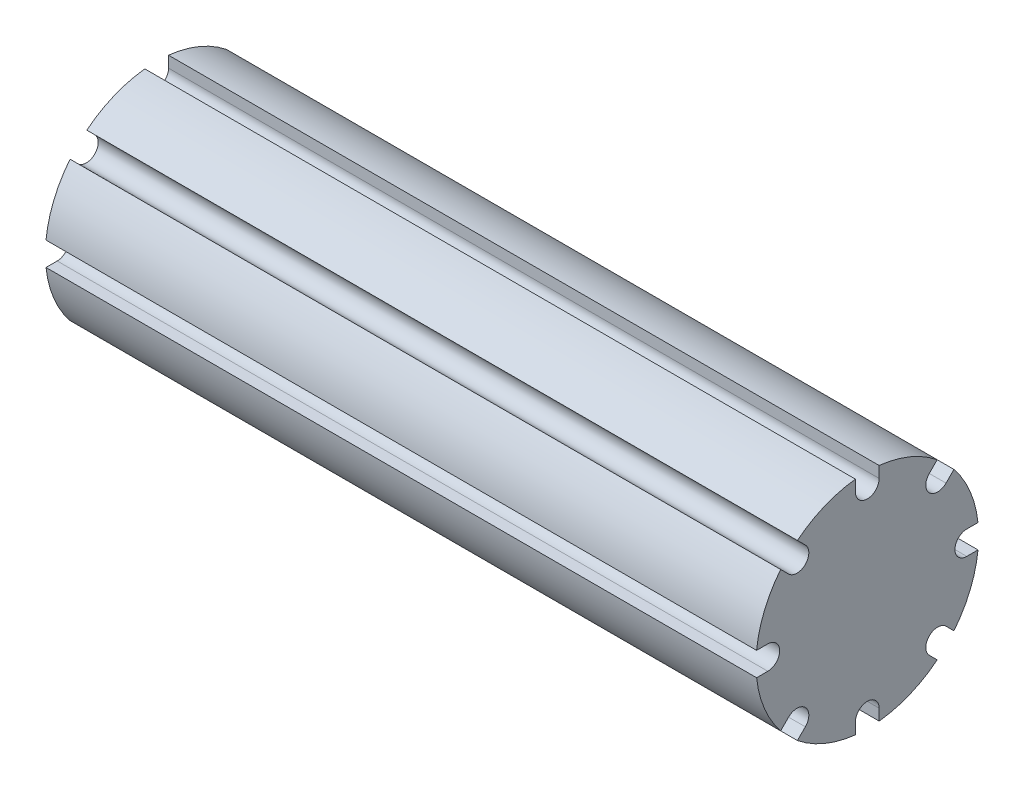
ISO-10303-21;
HEADER;
FILE_DESCRIPTION(('STEP AP214'),'2;1');
FILE_NAME('part.step','',(''),(''),'','','');
FILE_SCHEMA(('AUTOMOTIVE_DESIGN { 1 0 10303 214 1 1 1 1 }'));
ENDSEC;
DATA;
#1=APPLICATION_CONTEXT('core data for automotive mechanical design processes');
#2=APPLICATION_PROTOCOL_DEFINITION('international standard','automotive_design',2000,#1);
#3=PRODUCT_CONTEXT('',#1,'mechanical');
#4=PRODUCT('Part','Part','',(#3));
#5=PRODUCT_RELATED_PRODUCT_CATEGORY('part','',(#4));
#6=PRODUCT_DEFINITION_FORMATION('','',#4);
#7=PRODUCT_DEFINITION_CONTEXT('part definition',#1,'design');
#8=PRODUCT_DEFINITION('design','',#6,#7);
#9=PRODUCT_DEFINITION_SHAPE('','',#8);
#10=(LENGTH_UNIT() NAMED_UNIT(*) SI_UNIT(.MILLI.,.METRE.));
#11=(NAMED_UNIT(*) PLANE_ANGLE_UNIT() SI_UNIT($,.RADIAN.));
#12=(NAMED_UNIT(*) SI_UNIT($,.STERADIAN.) SOLID_ANGLE_UNIT());
#13=UNCERTAINTY_MEASURE_WITH_UNIT(LENGTH_MEASURE(1.E-05),#10,'distance_accuracy_value','');
#14=(GEOMETRIC_REPRESENTATION_CONTEXT(3) GLOBAL_UNCERTAINTY_ASSIGNED_CONTEXT((#13)) GLOBAL_UNIT_ASSIGNED_CONTEXT((#10,
#11,#12)) REPRESENTATION_CONTEXT('',''));
#15=CARTESIAN_POINT('',(0.,0.,0.));
#16=DIRECTION('',(0.,0.,1.));
#17=DIRECTION('',(1.,0.,0.));
#18=AXIS2_PLACEMENT_3D('',#15,#16,#17);
#19=CARTESIAN_POINT('',(75.,0.,0.));
#20=DIRECTION('',(-1.,0.,0.));
#21=DIRECTION('',(0.,0.,1.));
#22=AXIS2_PLACEMENT_3D('',#19,#20,#21);
#23=CYLINDRICAL_SURFACE('',#22,23.5);
#24=DIRECTION('',(1.,0.,0.));
#25=VECTOR('',#24,1.);
#26=CARTESIAN_POINT('',(-75.,2.49999999999992,-23.3666428910959));
#27=LINE('',#26,#25);
#28=CARTESIAN_POINT('',(-75.,2.49999999999992,-23.3666428910959));
#29=VERTEX_POINT('',#28);
#30=CARTESIAN_POINT('',(75.,2.49999999999992,-23.3666428910959));
#31=VERTEX_POINT('',#30);
#32=EDGE_CURVE('E336',#29,#31,#27,.T.);
#33=ORIENTED_EDGE('',*,*,#32,.F.);
#34=CARTESIAN_POINT('',(-75.,0.,0.));
#35=DIRECTION('',(1.,0.,0.));
#36=DIRECTION('',(0.,0.,-1.));
#37=AXIS2_PLACEMENT_3D('',#34,#35,#36);
#38=CIRCLE('',#37,23.5);
#39=CARTESIAN_POINT('',(-75.,14.7549446888919,-18.2904785948247));
#40=VERTEX_POINT('',#39);
#41=EDGE_CURVE('E487',#29,#40,#38,.T.);
#42=ORIENTED_EDGE('',*,*,#41,.T.);
#43=DIRECTION('',(1.,0.,0.));
#44=VECTOR('',#43,1.);
#45=CARTESIAN_POINT('',(-75.,14.7549446888919,-18.2904785948247));
#46=LINE('',#45,#44);
#47=CARTESIAN_POINT('',(75.,14.7549446888919,-18.2904785948247));
#48=VERTEX_POINT('',#47);
#49=EDGE_CURVE('E56',#40,#48,#46,.T.);
#50=ORIENTED_EDGE('',*,*,#49,.T.);
#51=CARTESIAN_POINT('',(75.,0.,0.));
#52=DIRECTION('',(1.,0.,0.));
#53=DIRECTION('',(0.,0.,-1.));
#54=AXIS2_PLACEMENT_3D('',#51,#52,#53);
#55=CIRCLE('',#54,23.5);
#56=EDGE_CURVE('E478',#31,#48,#55,.T.);
#57=ORIENTED_EDGE('',*,*,#56,.F.);
#58=EDGE_LOOP('',(#33,#42,#50,#57));
#59=FACE_BOUND('',#58,.T.);
#60=ADVANCED_FACE('F39',(#59),#23,.T.);
#61=CARTESIAN_POINT('',(-75.,-14.754944688892,-18.2904785948246));
#62=VERTEX_POINT('',#61);
#63=CARTESIAN_POINT('',(-75.,-2.50000000000008,-23.3666428910958));
#64=VERTEX_POINT('',#63);
#65=EDGE_CURVE('E490',#62,#64,#38,.T.);
#66=ORIENTED_EDGE('',*,*,#65,.T.);
#67=DIRECTION('',(1.,0.,0.));
#68=VECTOR('',#67,1.);
#69=CARTESIAN_POINT('',(-75.,-2.50000000000008,-23.3666428910958));
#70=LINE('',#69,#68);
#71=CARTESIAN_POINT('',(75.,-2.50000000000008,-23.3666428910958));
#72=VERTEX_POINT('',#71);
#73=EDGE_CURVE('E64',#64,#72,#70,.T.);
#74=ORIENTED_EDGE('',*,*,#73,.T.);
#75=CARTESIAN_POINT('',(75.,-14.754944688892,-18.2904785948246));
#76=VERTEX_POINT('',#75);
#77=EDGE_CURVE('E480',#76,#72,#55,.T.);
#78=ORIENTED_EDGE('',*,*,#77,.F.);
#79=DIRECTION('',(1.,0.,0.));
#80=VECTOR('',#79,1.);
#81=CARTESIAN_POINT('',(-75.,-14.754944688892,-18.2904785948246));
#82=LINE('',#81,#80);
#83=EDGE_CURVE('E359',#62,#76,#82,.T.);
#84=ORIENTED_EDGE('',*,*,#83,.F.);
#85=EDGE_LOOP('',(#66,#74,#78,#84));
#86=FACE_BOUND('',#85,.T.);
#87=ADVANCED_FACE('F537',(#86),#23,.T.);
#88=CARTESIAN_POINT('',(-75.,-23.3666428910959,-2.5));
#89=VERTEX_POINT('',#88);
#90=CARTESIAN_POINT('',(-75.,-18.2904785948248,-14.7549446888918));
#91=VERTEX_POINT('',#90);
#92=EDGE_CURVE('E495',#89,#91,#38,.T.);
#93=ORIENTED_EDGE('',*,*,#92,.T.);
#94=DIRECTION('',(1.,0.,0.));
#95=VECTOR('',#94,1.);
#96=CARTESIAN_POINT('',(-75.,-18.2904785948248,-14.7549446888918));
#97=LINE('',#96,#95);
#98=CARTESIAN_POINT('',(75.,-18.2904785948248,-14.7549446888918));
#99=VERTEX_POINT('',#98);
#100=EDGE_CURVE('E361',#91,#99,#97,.T.);
#101=ORIENTED_EDGE('',*,*,#100,.T.);
#102=CARTESIAN_POINT('',(75.,-23.3666428910959,-2.5));
#103=VERTEX_POINT('',#102);
#104=EDGE_CURVE('E526',#103,#99,#55,.T.);
#105=ORIENTED_EDGE('',*,*,#104,.F.);
#106=DIRECTION('',(1.,0.,0.));
#107=VECTOR('',#106,1.);
#108=CARTESIAN_POINT('',(-75.,-23.3666428910959,-2.5));
#109=LINE('',#108,#107);
#110=EDGE_CURVE('E384',#89,#103,#109,.T.);
#111=ORIENTED_EDGE('',*,*,#110,.F.);
#112=EDGE_LOOP('',(#93,#101,#105,#111));
#113=FACE_BOUND('',#112,.T.);
#114=ADVANCED_FACE('F586',(#113),#23,.T.);
#115=CARTESIAN_POINT('',(-75.,-18.2904785948245,14.7549446888921));
#116=VERTEX_POINT('',#115);
#117=CARTESIAN_POINT('',(-75.,-23.3666428910959,2.5));
#118=VERTEX_POINT('',#117);
#119=EDGE_CURVE('E500',#116,#118,#38,.T.);
#120=ORIENTED_EDGE('',*,*,#119,.T.);
#121=DIRECTION('',(1.,0.,0.));
#122=VECTOR('',#121,1.);
#123=CARTESIAN_POINT('',(-75.,-23.3666428910959,2.5));
#124=LINE('',#123,#122);
#125=CARTESIAN_POINT('',(75.,-23.3666428910959,2.5));
#126=VERTEX_POINT('',#125);
#127=EDGE_CURVE('E386',#118,#126,#124,.T.);
#128=ORIENTED_EDGE('',*,*,#127,.T.);
#129=CARTESIAN_POINT('',(75.,-18.2904785948245,14.7549446888921));
#130=VERTEX_POINT('',#129);
#131=EDGE_CURVE('E523',#130,#126,#55,.T.);
#132=ORIENTED_EDGE('',*,*,#131,.F.);
#133=DIRECTION('',(1.,0.,0.));
#134=VECTOR('',#133,1.);
#135=CARTESIAN_POINT('',(-75.,-18.2904785948245,14.7549446888921));
#136=LINE('',#135,#134);
#137=EDGE_CURVE('E407',#116,#130,#136,.T.);
#138=ORIENTED_EDGE('',*,*,#137,.F.);
#139=EDGE_LOOP('',(#120,#128,#132,#138));
#140=FACE_BOUND('',#139,.T.);
#141=ADVANCED_FACE('F581',(#140),#23,.T.);
#142=CARTESIAN_POINT('',(-75.,-2.49999999999976,23.3666428910959));
#143=VERTEX_POINT('',#142);
#144=CARTESIAN_POINT('',(-75.,-14.7549446888918,18.2904785948248));
#145=VERTEX_POINT('',#144);
#146=EDGE_CURVE('E486',#143,#145,#38,.T.);
#147=ORIENTED_EDGE('',*,*,#146,.T.);
#148=DIRECTION('',(1.,0.,0.));
#149=VECTOR('',#148,1.);
#150=CARTESIAN_POINT('',(-75.,-14.7549446888918,18.2904785948248));
#151=LINE('',#150,#149);
#152=CARTESIAN_POINT('',(75.,-14.7549446888918,18.2904785948248));
#153=VERTEX_POINT('',#152);
#154=EDGE_CURVE('E409',#145,#153,#151,.T.);
#155=ORIENTED_EDGE('',*,*,#154,.T.);
#156=CARTESIAN_POINT('',(75.,-2.49999999999976,23.3666428910959));
#157=VERTEX_POINT('',#156);
#158=EDGE_CURVE('E521',#157,#153,#55,.T.);
#159=ORIENTED_EDGE('',*,*,#158,.F.);
#160=DIRECTION('',(1.,0.,0.));
#161=VECTOR('',#160,1.);
#162=CARTESIAN_POINT('',(-75.,-2.49999999999976,23.3666428910959));
#163=LINE('',#162,#161);
#164=EDGE_CURVE('E289',#143,#157,#163,.T.);
#165=ORIENTED_EDGE('',*,*,#164,.F.);
#166=EDGE_LOOP('',(#147,#155,#159,#165));
#167=FACE_BOUND('',#166,.T.);
#168=ADVANCED_FACE('F511',(#167),#23,.T.);
#169=CARTESIAN_POINT('',(-75.,14.7549446888922,18.2904785948245));
#170=VERTEX_POINT('',#169);
#171=CARTESIAN_POINT('',(-75.,2.50000000000025,23.3666428910958));
#172=VERTEX_POINT('',#171);
#173=EDGE_CURVE('E482',#170,#172,#38,.T.);
#174=ORIENTED_EDGE('',*,*,#173,.T.);
#175=DIRECTION('',(1.,0.,0.));
#176=VECTOR('',#175,1.);
#177=CARTESIAN_POINT('',(-75.,2.50000000000025,23.3666428910958));
#178=LINE('',#177,#176);
#179=CARTESIAN_POINT('',(75.,2.50000000000025,23.3666428910958));
#180=VERTEX_POINT('',#179);
#181=EDGE_CURVE('E262',#172,#180,#178,.T.);
#182=ORIENTED_EDGE('',*,*,#181,.T.);
#183=CARTESIAN_POINT('',(75.,14.7549446888922,18.2904785948245));
#184=VERTEX_POINT('',#183);
#185=EDGE_CURVE('E48',#184,#180,#55,.T.);
#186=ORIENTED_EDGE('',*,*,#185,.F.);
#187=DIRECTION('',(1.,0.,0.));
#188=VECTOR('',#187,1.);
#189=CARTESIAN_POINT('',(-75.,14.7549446888922,18.2904785948245));
#190=LINE('',#189,#188);
#191=EDGE_CURVE('E310',#170,#184,#190,.T.);
#192=ORIENTED_EDGE('',*,*,#191,.F.);
#193=EDGE_LOOP('',(#174,#182,#186,#192));
#194=FACE_BOUND('',#193,.T.);
#195=ADVANCED_FACE('F575',(#194),#23,.T.);
#196=DIRECTION('',(1.,0.,0.));
#197=VECTOR('',#196,1.);
#198=CARTESIAN_POINT('',(-75.,18.2904785948247,-14.754944688892));
#199=LINE('',#198,#197);
#200=CARTESIAN_POINT('',(-75.,18.2904785948247,-14.754944688892));
#201=VERTEX_POINT('',#200);
#202=CARTESIAN_POINT('',(75.,18.2904785948247,-14.754944688892));
#203=VERTEX_POINT('',#202);
#204=EDGE_CURVE('E431',#201,#203,#199,.T.);
#205=ORIENTED_EDGE('',*,*,#204,.F.);
#206=CARTESIAN_POINT('',(-75.,23.3666428910959,-2.5));
#207=VERTEX_POINT('',#206);
#208=EDGE_CURVE('E454',#201,#207,#38,.T.);
#209=ORIENTED_EDGE('',*,*,#208,.T.);
#210=DIRECTION('',(1.,0.,0.));
#211=VECTOR('',#210,1.);
#212=CARTESIAN_POINT('',(-75.,23.3666428910959,-2.5));
#213=LINE('',#212,#211);
#214=CARTESIAN_POINT('',(75.,23.3666428910959,-2.5));
#215=VERTEX_POINT('',#214);
#216=EDGE_CURVE('E457',#207,#215,#213,.T.);
#217=ORIENTED_EDGE('',*,*,#216,.T.);
#218=EDGE_CURVE('E49',#203,#215,#55,.T.);
#219=ORIENTED_EDGE('',*,*,#218,.F.);
#220=EDGE_LOOP('',(#205,#209,#217,#219));
#221=FACE_BOUND('',#220,.T.);
#222=ADVANCED_FACE('F555',(#221),#23,.T.);
#223=CARTESIAN_POINT('',(75.,0.,0.));
#224=DIRECTION('',(1.,0.,0.));
#225=DIRECTION('',(0.,0.,-1.));
#226=AXIS2_PLACEMENT_3D('',#223,#224,#225);
#227=PLANE('',#226);
#228=CARTESIAN_POINT('',(75.,0.,-21.));
#229=DIRECTION('',(1.,0.,0.));
#230=DIRECTION('',(0.,-1.,0.));
#231=AXIS2_PLACEMENT_3D('',#228,#229,#230);
#232=CIRCLE('',#231,2.5);
#233=CARTESIAN_POINT('',(75.,2.49999999999993,-21.));
#234=VERTEX_POINT('',#233);
#235=CARTESIAN_POINT('',(75.,-2.50000000000007,-21.));
#236=VERTEX_POINT('',#235);
#237=EDGE_CURVE('E325',#234,#236,#232,.T.);
#238=ORIENTED_EDGE('',*,*,#237,.F.);
#239=DIRECTION('',(0.,0.,-1.));
#240=VECTOR('',#239,1.);
#241=CARTESIAN_POINT('',(75.,2.5,0.));
#242=LINE('',#241,#240);
#243=EDGE_CURVE('E320',#234,#31,#242,.T.);
#244=ORIENTED_EDGE('',*,*,#243,.T.);
#245=ORIENTED_EDGE('',*,*,#56,.T.);
#246=DIRECTION('',(0.,0.707106781186546,-0.707106781186549));
#247=VECTOR('',#246,1.);
#248=CARTESIAN_POINT('',(75.,-1.76776695296637,-1.76776695296637));
#249=LINE('',#248,#247);
#250=CARTESIAN_POINT('',(75.,13.0814754519511,-16.6170093578839));
#251=VERTEX_POINT('',#250);
#252=EDGE_CURVE('E424',#251,#48,#249,.T.);
#253=ORIENTED_EDGE('',*,*,#252,.F.);
#254=CARTESIAN_POINT('',(75.,14.8492424049175,-14.8492424049175));
#255=DIRECTION('',(1.,0.,0.));
#256=DIRECTION('',(0.,-0.707106781186549,-0.707106781186546));
#257=AXIS2_PLACEMENT_3D('',#254,#255,#256);
#258=CIRCLE('',#257,2.5);
#259=CARTESIAN_POINT('',(75.,16.6170093578838,-13.0814754519512));
#260=VERTEX_POINT('',#259);
#261=EDGE_CURVE('E335',#260,#251,#258,.T.);
#262=ORIENTED_EDGE('',*,*,#261,.F.);
#263=DIRECTION('',(0.,0.707106781186546,-0.707106781186549));
#264=VECTOR('',#263,1.);
#265=CARTESIAN_POINT('',(75.,1.76776695296637,1.76776695296637));
#266=LINE('',#265,#264);
#267=EDGE_CURVE('E417',#260,#203,#266,.T.);
#268=ORIENTED_EDGE('',*,*,#267,.T.);
#269=ORIENTED_EDGE('',*,*,#218,.T.);
#270=DIRECTION('',(0.,1.,0.));
#271=VECTOR('',#270,1.);
#272=CARTESIAN_POINT('',(75.,0.,-2.5));
#273=LINE('',#272,#271);
#274=CARTESIAN_POINT('',(75.,21.,-2.5));
#275=VERTEX_POINT('',#274);
#276=EDGE_CURVE('E447',#275,#215,#273,.T.);
#277=ORIENTED_EDGE('',*,*,#276,.F.);
#278=CARTESIAN_POINT('',(75.,21.,0.));
#279=DIRECTION('',(1.,0.,0.));
#280=DIRECTION('',(0.,0.,-1.));
#281=AXIS2_PLACEMENT_3D('',#278,#279,#280);
#282=CIRCLE('',#281,2.5);
#283=CARTESIAN_POINT('',(75.,21.,2.5));
#284=VERTEX_POINT('',#283);
#285=EDGE_CURVE('E430',#284,#275,#282,.T.);
#286=ORIENTED_EDGE('',*,*,#285,.F.);
#287=DIRECTION('',(0.,1.,0.));
#288=VECTOR('',#287,1.);
#289=CARTESIAN_POINT('',(75.,0.,2.5));
#290=LINE('',#289,#288);
#291=CARTESIAN_POINT('',(75.,23.3666428910959,2.5));
#292=VERTEX_POINT('',#291);
#293=EDGE_CURVE('E439',#284,#292,#290,.T.);
#294=ORIENTED_EDGE('',*,*,#293,.T.);
#295=CARTESIAN_POINT('',(75.,18.2904785948249,14.7549446888917));
#296=VERTEX_POINT('',#295);
#297=EDGE_CURVE('E11',#292,#296,#55,.T.);
#298=ORIENTED_EDGE('',*,*,#297,.T.);
#299=DIRECTION('',(0.,0.707106781186556,0.707106781186539));
#300=VECTOR('',#299,1.);
#301=CARTESIAN_POINT('',(75.,1.76776695296635,-1.76776695296639));
#302=LINE('',#301,#300);
#303=CARTESIAN_POINT('',(75.,16.617009357884,13.0814754519509));
#304=VERTEX_POINT('',#303);
#305=EDGE_CURVE('E305',#304,#296,#302,.T.);
#306=ORIENTED_EDGE('',*,*,#305,.F.);
#307=CARTESIAN_POINT('',(75.,14.8492424049177,14.8492424049173));
#308=DIRECTION('',(1.,0.,0.));
#309=DIRECTION('',(0.,0.707106781186539,-0.707106781186556));
#310=AXIS2_PLACEMENT_3D('',#307,#308,#309);
#311=CIRCLE('',#310,2.5);
#312=CARTESIAN_POINT('',(75.,13.0814754519513,16.6170093578837));
#313=VERTEX_POINT('',#312);
#314=EDGE_CURVE('E302',#313,#304,#311,.T.);
#315=ORIENTED_EDGE('',*,*,#314,.F.);
#316=DIRECTION('',(0.,0.707106781186556,0.707106781186539));
#317=VECTOR('',#316,1.);
#318=CARTESIAN_POINT('',(75.,-1.76776695296635,1.76776695296639));
#319=LINE('',#318,#317);
#320=EDGE_CURVE('E296',#313,#184,#319,.T.);
#321=ORIENTED_EDGE('',*,*,#320,.T.);
#322=ORIENTED_EDGE('',*,*,#185,.T.);
#323=DIRECTION('',(0.,0.,1.));
#324=VECTOR('',#323,1.);
#325=CARTESIAN_POINT('',(75.,2.5,0.));
#326=LINE('',#325,#324);
#327=CARTESIAN_POINT('',(75.,2.50000000000022,21.));
#328=VERTEX_POINT('',#327);
#329=EDGE_CURVE('E279',#328,#180,#326,.T.);
#330=ORIENTED_EDGE('',*,*,#329,.F.);
#331=CARTESIAN_POINT('',(75.,2.19963324347117E-13,21.));
#332=DIRECTION('',(1.,0.,0.));
#333=DIRECTION('',(0.,1.,0.));
#334=AXIS2_PLACEMENT_3D('',#331,#332,#333);
#335=CIRCLE('',#334,2.5);
#336=CARTESIAN_POINT('',(75.,-2.49999999999978,21.));
#337=VERTEX_POINT('',#336);
#338=EDGE_CURVE('E259',#337,#328,#335,.T.);
#339=ORIENTED_EDGE('',*,*,#338,.F.);
#340=DIRECTION('',(0.,0.,1.));
#341=VECTOR('',#340,1.);
#342=CARTESIAN_POINT('',(75.,-2.5,0.));
#343=LINE('',#342,#341);
#344=EDGE_CURVE('E276',#337,#157,#343,.T.);
#345=ORIENTED_EDGE('',*,*,#344,.T.);
#346=ORIENTED_EDGE('',*,*,#158,.T.);
#347=DIRECTION('',(0.,-0.707106781186541,0.707106781186554));
#348=VECTOR('',#347,1.);
#349=CARTESIAN_POINT('',(75.,1.76776695296638,1.76776695296635));
#350=LINE('',#349,#348);
#351=CARTESIAN_POINT('',(75.,-13.081475451951,16.617009357884));
#352=VERTEX_POINT('',#351);
#353=EDGE_CURVE('E402',#352,#153,#350,.T.);
#354=ORIENTED_EDGE('',*,*,#353,.F.);
#355=CARTESIAN_POINT('',(75.,-14.8492424049174,14.8492424049176));
#356=DIRECTION('',(1.,0.,0.));
#357=DIRECTION('',(0.,0.707106781186554,0.707106781186541));
#358=AXIS2_PLACEMENT_3D('',#355,#356,#357);
#359=CIRCLE('',#358,2.5);
#360=CARTESIAN_POINT('',(75.,-16.6170093578838,13.0814754519513));
#361=VERTEX_POINT('',#360);
#362=EDGE_CURVE('E288',#361,#352,#359,.T.);
#363=ORIENTED_EDGE('',*,*,#362,.F.);
#364=DIRECTION('',(0.,-0.707106781186541,0.707106781186554));
#365=VECTOR('',#364,1.);
#366=CARTESIAN_POINT('',(75.,-1.76776695296638,-1.76776695296635));
#367=LINE('',#366,#365);
#368=EDGE_CURVE('E394',#361,#130,#367,.T.);
#369=ORIENTED_EDGE('',*,*,#368,.T.);
#370=ORIENTED_EDGE('',*,*,#131,.T.);
#371=DIRECTION('',(0.,-1.,0.));
#372=VECTOR('',#371,1.);
#373=CARTESIAN_POINT('',(75.,0.,2.5));
#374=LINE('',#373,#372);
#375=CARTESIAN_POINT('',(75.,-21.,2.5));
#376=VERTEX_POINT('',#375);
#377=EDGE_CURVE('E378',#376,#126,#374,.T.);
#378=ORIENTED_EDGE('',*,*,#377,.F.);
#379=CARTESIAN_POINT('',(75.,-21.,0.));
#380=DIRECTION('',(1.,0.,0.));
#381=DIRECTION('',(0.,0.,1.));
#382=AXIS2_PLACEMENT_3D('',#379,#380,#381);
#383=CIRCLE('',#382,2.5);
#384=CARTESIAN_POINT('',(75.,-21.,-2.5));
#385=VERTEX_POINT('',#384);
#386=EDGE_CURVE('E375',#385,#376,#383,.T.);
#387=ORIENTED_EDGE('',*,*,#386,.F.);
#388=DIRECTION('',(0.,-1.,0.));
#389=VECTOR('',#388,1.);
#390=CARTESIAN_POINT('',(75.,0.,-2.5));
#391=LINE('',#390,#389);
#392=EDGE_CURVE('E369',#385,#103,#391,.T.);
#393=ORIENTED_EDGE('',*,*,#392,.T.);
#394=ORIENTED_EDGE('',*,*,#104,.T.);
#395=DIRECTION('',(0.,-0.707106781186551,-0.707106781186544));
#396=VECTOR('',#395,1.);
#397=CARTESIAN_POINT('',(75.,-1.76776695296636,1.76776695296638));
#398=LINE('',#397,#396);
#399=CARTESIAN_POINT('',(75.,-16.6170093578839,-13.081475451951));
#400=VERTEX_POINT('',#399);
#401=EDGE_CURVE('E353',#400,#99,#398,.T.);
#402=ORIENTED_EDGE('',*,*,#401,.F.);
#403=CARTESIAN_POINT('',(75.,-14.8492424049176,-14.8492424049174));
#404=DIRECTION('',(1.,0.,0.));
#405=DIRECTION('',(0.,-0.707106781186544,0.707106781186551));
#406=AXIS2_PLACEMENT_3D('',#403,#404,#405);
#407=CIRCLE('',#406,2.5);
#408=CARTESIAN_POINT('',(75.,-13.0814754519512,-16.6170093578838));
#409=VERTEX_POINT('',#408);
#410=EDGE_CURVE('E350',#409,#400,#407,.T.);
#411=ORIENTED_EDGE('',*,*,#410,.F.);
#412=DIRECTION('',(0.,-0.707106781186551,-0.707106781186544));
#413=VECTOR('',#412,1.);
#414=CARTESIAN_POINT('',(75.,1.76776695296636,-1.76776695296638));
#415=LINE('',#414,#413);
#416=EDGE_CURVE('E344',#409,#76,#415,.T.);
#417=ORIENTED_EDGE('',*,*,#416,.T.);
#418=ORIENTED_EDGE('',*,*,#77,.T.);
#419=DIRECTION('',(0.,0.,-1.));
#420=VECTOR('',#419,1.);
#421=CARTESIAN_POINT('',(75.,-2.5,0.));
#422=LINE('',#421,#420);
#423=EDGE_CURVE('E328',#236,#72,#422,.T.);
#424=ORIENTED_EDGE('',*,*,#423,.F.);
#425=EDGE_LOOP('',(#238,#244,#245,#253,#262,#268,#269,#277,#286,#294,#298,#306,#315,#321,#322,
#330,#339,#345,#346,#354,#363,#369,#370,#378,#387,#393,#394,#402,#411,#417,#418,#424));
#426=FACE_BOUND('',#425,.T.);
#427=ADVANCED_FACE('F472',(#426),#227,.T.);
#428=CARTESIAN_POINT('',(-75.,0.,0.));
#429=DIRECTION('',(1.,0.,0.));
#430=DIRECTION('',(0.,0.,-1.));
#431=AXIS2_PLACEMENT_3D('',#428,#429,#430);
#432=PLANE('',#431);
#433=DIRECTION('',(0.,0.,-1.));
#434=VECTOR('',#433,1.);
#435=CARTESIAN_POINT('',(-75.,2.5,0.));
#436=LINE('',#435,#434);
#437=CARTESIAN_POINT('',(-75.,2.49999999999993,-21.));
#438=VERTEX_POINT('',#437);
#439=EDGE_CURVE('E322',#438,#29,#436,.T.);
#440=ORIENTED_EDGE('',*,*,#439,.F.);
#441=CARTESIAN_POINT('',(-75.,0.,-21.));
#442=DIRECTION('',(1.,0.,0.));
#443=DIRECTION('',(0.,-1.,0.));
#444=AXIS2_PLACEMENT_3D('',#441,#442,#443);
#445=CIRCLE('',#444,2.5);
#446=CARTESIAN_POINT('',(-75.,-2.50000000000007,-21.));
#447=VERTEX_POINT('',#446);
#448=EDGE_CURVE('E316',#438,#447,#445,.T.);
#449=ORIENTED_EDGE('',*,*,#448,.T.);
#450=DIRECTION('',(0.,0.,-1.));
#451=VECTOR('',#450,1.);
#452=CARTESIAN_POINT('',(-75.,-2.5,0.));
#453=LINE('',#452,#451);
#454=EDGE_CURVE('E319',#447,#64,#453,.T.);
#455=ORIENTED_EDGE('',*,*,#454,.T.);
#456=ORIENTED_EDGE('',*,*,#65,.F.);
#457=DIRECTION('',(0.,-0.707106781186551,-0.707106781186544));
#458=VECTOR('',#457,1.);
#459=CARTESIAN_POINT('',(-75.,1.76776695296636,-1.76776695296638));
#460=LINE('',#459,#458);
#461=CARTESIAN_POINT('',(-75.,-13.0814754519512,-16.6170093578838));
#462=VERTEX_POINT('',#461);
#463=EDGE_CURVE('E347',#462,#62,#460,.T.);
#464=ORIENTED_EDGE('',*,*,#463,.F.);
#465=CARTESIAN_POINT('',(-75.,-14.8492424049176,-14.8492424049174));
#466=DIRECTION('',(1.,0.,0.));
#467=DIRECTION('',(0.,-0.707106781186544,0.707106781186551));
#468=AXIS2_PLACEMENT_3D('',#465,#466,#467);
#469=CIRCLE('',#468,2.5);
#470=CARTESIAN_POINT('',(-75.,-16.6170093578839,-13.081475451951));
#471=VERTEX_POINT('',#470);
#472=EDGE_CURVE('E340',#462,#471,#469,.T.);
#473=ORIENTED_EDGE('',*,*,#472,.T.);
#474=DIRECTION('',(0.,-0.707106781186551,-0.707106781186544));
#475=VECTOR('',#474,1.);
#476=CARTESIAN_POINT('',(-75.,-1.76776695296636,1.76776695296638));
#477=LINE('',#476,#475);
#478=EDGE_CURVE('E343',#471,#91,#477,.T.);
#479=ORIENTED_EDGE('',*,*,#478,.T.);
#480=ORIENTED_EDGE('',*,*,#92,.F.);
#481=DIRECTION('',(0.,-1.,0.));
#482=VECTOR('',#481,1.);
#483=CARTESIAN_POINT('',(-75.,0.,-2.5));
#484=LINE('',#483,#482);
#485=CARTESIAN_POINT('',(-75.,-21.,-2.5));
#486=VERTEX_POINT('',#485);
#487=EDGE_CURVE('E372',#486,#89,#484,.T.);
#488=ORIENTED_EDGE('',*,*,#487,.F.);
#489=CARTESIAN_POINT('',(-75.,-21.,0.));
#490=DIRECTION('',(1.,0.,0.));
#491=DIRECTION('',(0.,0.,1.));
#492=AXIS2_PLACEMENT_3D('',#489,#490,#491);
#493=CIRCLE('',#492,2.5);
#494=CARTESIAN_POINT('',(-75.,-21.,2.5));
#495=VERTEX_POINT('',#494);
#496=EDGE_CURVE('E365',#486,#495,#493,.T.);
#497=ORIENTED_EDGE('',*,*,#496,.T.);
#498=DIRECTION('',(0.,-1.,0.));
#499=VECTOR('',#498,1.);
#500=CARTESIAN_POINT('',(-75.,0.,2.5));
#501=LINE('',#500,#499);
#502=EDGE_CURVE('E368',#495,#118,#501,.T.);
#503=ORIENTED_EDGE('',*,*,#502,.T.);
#504=ORIENTED_EDGE('',*,*,#119,.F.);
#505=DIRECTION('',(0.,-0.707106781186541,0.707106781186554));
#506=VECTOR('',#505,1.);
#507=CARTESIAN_POINT('',(-75.,-1.76776695296638,-1.76776695296635));
#508=LINE('',#507,#506);
#509=CARTESIAN_POINT('',(-75.,-16.6170093578838,13.0814754519513));
#510=VERTEX_POINT('',#509);
#511=EDGE_CURVE('E397',#510,#116,#508,.T.);
#512=ORIENTED_EDGE('',*,*,#511,.F.);
#513=CARTESIAN_POINT('',(-75.,-14.8492424049174,14.8492424049176));
#514=DIRECTION('',(1.,0.,0.));
#515=DIRECTION('',(0.,0.707106781186554,0.707106781186541));
#516=AXIS2_PLACEMENT_3D('',#513,#514,#515);
#517=CIRCLE('',#516,2.5);
#518=CARTESIAN_POINT('',(-75.,-13.081475451951,16.617009357884));
#519=VERTEX_POINT('',#518);
#520=EDGE_CURVE('E390',#510,#519,#517,.T.);
#521=ORIENTED_EDGE('',*,*,#520,.T.);
#522=DIRECTION('',(0.,-0.707106781186541,0.707106781186554));
#523=VECTOR('',#522,1.);
#524=CARTESIAN_POINT('',(-75.,1.76776695296638,1.76776695296635));
#525=LINE('',#524,#523);
#526=EDGE_CURVE('E393',#519,#145,#525,.T.);
#527=ORIENTED_EDGE('',*,*,#526,.T.);
#528=ORIENTED_EDGE('',*,*,#146,.F.);
#529=DIRECTION('',(0.,0.,1.));
#530=VECTOR('',#529,1.);
#531=CARTESIAN_POINT('',(-75.,-2.5,0.));
#532=LINE('',#531,#530);
#533=CARTESIAN_POINT('',(-75.,-2.49999999999978,21.));
#534=VERTEX_POINT('',#533);
#535=EDGE_CURVE('E263',#534,#143,#532,.T.);
#536=ORIENTED_EDGE('',*,*,#535,.F.);
#537=CARTESIAN_POINT('',(-75.,2.19963324347117E-13,21.));
#538=DIRECTION('',(1.,0.,0.));
#539=DIRECTION('',(0.,1.,0.));
#540=AXIS2_PLACEMENT_3D('',#537,#538,#539);
#541=CIRCLE('',#540,2.5);
#542=CARTESIAN_POINT('',(-75.,2.50000000000022,21.));
#543=VERTEX_POINT('',#542);
#544=EDGE_CURVE('E256',#534,#543,#541,.T.);
#545=ORIENTED_EDGE('',*,*,#544,.T.);
#546=DIRECTION('',(0.,0.,1.));
#547=VECTOR('',#546,1.);
#548=CARTESIAN_POINT('',(-75.,2.5,0.));
#549=LINE('',#548,#547);
#550=EDGE_CURVE('E266',#543,#172,#549,.T.);
#551=ORIENTED_EDGE('',*,*,#550,.T.);
#552=ORIENTED_EDGE('',*,*,#173,.F.);
#553=DIRECTION('',(0.,0.707106781186556,0.707106781186539));
#554=VECTOR('',#553,1.);
#555=CARTESIAN_POINT('',(-75.,-1.76776695296635,1.76776695296639));
#556=LINE('',#555,#554);
#557=CARTESIAN_POINT('',(-75.,13.0814754519513,16.6170093578837));
#558=VERTEX_POINT('',#557);
#559=EDGE_CURVE('E299',#558,#170,#556,.T.);
#560=ORIENTED_EDGE('',*,*,#559,.F.);
#561=CARTESIAN_POINT('',(-75.,14.8492424049177,14.8492424049173));
#562=DIRECTION('',(1.,0.,0.));
#563=DIRECTION('',(0.,0.707106781186539,-0.707106781186556));
#564=AXIS2_PLACEMENT_3D('',#561,#562,#563);
#565=CIRCLE('',#564,2.5);
#566=CARTESIAN_POINT('',(-75.,16.617009357884,13.0814754519509));
#567=VERTEX_POINT('',#566);
#568=EDGE_CURVE('E292',#558,#567,#565,.T.);
#569=ORIENTED_EDGE('',*,*,#568,.T.);
#570=DIRECTION('',(0.,0.707106781186556,0.707106781186539));
#571=VECTOR('',#570,1.);
#572=CARTESIAN_POINT('',(-75.,1.76776695296635,-1.76776695296639));
#573=LINE('',#572,#571);
#574=CARTESIAN_POINT('',(-75.,18.2904785948249,14.7549446888917));
#575=VERTEX_POINT('',#574);
#576=EDGE_CURVE('E295',#567,#575,#573,.T.);
#577=ORIENTED_EDGE('',*,*,#576,.T.);
#578=CARTESIAN_POINT('',(-75.,23.3666428910959,2.5));
#579=VERTEX_POINT('',#578);
#580=EDGE_CURVE('E43',#579,#575,#38,.T.);
#581=ORIENTED_EDGE('',*,*,#580,.F.);
#582=DIRECTION('',(0.,1.,0.));
#583=VECTOR('',#582,1.);
#584=CARTESIAN_POINT('',(-75.,0.,2.5));
#585=LINE('',#584,#583);
#586=CARTESIAN_POINT('',(-75.,21.,2.5));
#587=VERTEX_POINT('',#586);
#588=EDGE_CURVE('E442',#587,#579,#585,.T.);
#589=ORIENTED_EDGE('',*,*,#588,.F.);
#590=CARTESIAN_POINT('',(-75.,21.,0.));
#591=DIRECTION('',(1.,0.,0.));
#592=DIRECTION('',(0.,0.,-1.));
#593=AXIS2_PLACEMENT_3D('',#590,#591,#592);
#594=CIRCLE('',#593,2.5);
#595=CARTESIAN_POINT('',(-75.,21.,-2.5));
#596=VERTEX_POINT('',#595);
#597=EDGE_CURVE('E435',#587,#596,#594,.T.);
#598=ORIENTED_EDGE('',*,*,#597,.T.);
#599=DIRECTION('',(0.,1.,0.));
#600=VECTOR('',#599,1.);
#601=CARTESIAN_POINT('',(-75.,0.,-2.5));
#602=LINE('',#601,#600);
#603=EDGE_CURVE('E438',#596,#207,#602,.T.);
#604=ORIENTED_EDGE('',*,*,#603,.T.);
#605=ORIENTED_EDGE('',*,*,#208,.F.);
#606=DIRECTION('',(0.,0.707106781186546,-0.707106781186549));
#607=VECTOR('',#606,1.);
#608=CARTESIAN_POINT('',(-75.,1.76776695296637,1.76776695296637));
#609=LINE('',#608,#607);
#610=CARTESIAN_POINT('',(-75.,16.6170093578838,-13.0814754519512));
#611=VERTEX_POINT('',#610);
#612=EDGE_CURVE('E419',#611,#201,#609,.T.);
#613=ORIENTED_EDGE('',*,*,#612,.F.);
#614=CARTESIAN_POINT('',(-75.,14.8492424049175,-14.8492424049175));
#615=DIRECTION('',(1.,0.,0.));
#616=DIRECTION('',(0.,-0.707106781186549,-0.707106781186546));
#617=AXIS2_PLACEMENT_3D('',#614,#615,#616);
#618=CIRCLE('',#617,2.5);
#619=CARTESIAN_POINT('',(-75.,13.0814754519511,-16.6170093578839));
#620=VERTEX_POINT('',#619);
#621=EDGE_CURVE('E413',#611,#620,#618,.T.);
#622=ORIENTED_EDGE('',*,*,#621,.T.);
#623=DIRECTION('',(0.,0.707106781186546,-0.707106781186549));
#624=VECTOR('',#623,1.);
#625=CARTESIAN_POINT('',(-75.,-1.76776695296637,-1.76776695296637));
#626=LINE('',#625,#624);
#627=EDGE_CURVE('E416',#620,#40,#626,.T.);
#628=ORIENTED_EDGE('',*,*,#627,.T.);
#629=ORIENTED_EDGE('',*,*,#41,.F.);
#630=EDGE_LOOP('',(#440,#449,#455,#456,#464,#473,#479,#480,#488,#497,#503,#504,#512,#521,#527,
#528,#536,#545,#551,#552,#560,#569,#577,#581,#589,#598,#604,#605,#613,#622,#628,#629));
#631=FACE_BOUND('',#630,.T.);
#632=ADVANCED_FACE('F274',(#631),#432,.F.);
#633=ORIENTED_EDGE('',*,*,#580,.T.);
#634=DIRECTION('',(1.,0.,0.));
#635=VECTOR('',#634,1.);
#636=CARTESIAN_POINT('',(-75.,18.2904785948249,14.7549446888917));
#637=LINE('',#636,#635);
#638=EDGE_CURVE('E312',#575,#296,#637,.T.);
#639=ORIENTED_EDGE('',*,*,#638,.T.);
#640=ORIENTED_EDGE('',*,*,#297,.F.);
#641=DIRECTION('',(1.,0.,0.));
#642=VECTOR('',#641,1.);
#643=CARTESIAN_POINT('',(-75.,23.3666428910959,2.5));
#644=LINE('',#643,#642);
#645=EDGE_CURVE('E455',#579,#292,#644,.T.);
#646=ORIENTED_EDGE('',*,*,#645,.F.);
#647=EDGE_LOOP('',(#633,#639,#640,#646));
#648=FACE_BOUND('',#647,.T.);
#649=ADVANCED_FACE('F41',(#648),#23,.T.);
#650=CARTESIAN_POINT('',(-75.,21.,0.));
#651=DIRECTION('',(1.,0.,0.));
#652=DIRECTION('',(0.,0.,-1.));
#653=AXIS2_PLACEMENT_3D('',#650,#651,#652);
#654=CYLINDRICAL_SURFACE('',#653,2.5);
#655=ORIENTED_EDGE('',*,*,#285,.T.);
#656=DIRECTION('',(1.,0.,0.));
#657=VECTOR('',#656,1.);
#658=CARTESIAN_POINT('',(-75.,21.,-2.5));
#659=LINE('',#658,#657);
#660=EDGE_CURVE('E444',#596,#275,#659,.T.);
#661=ORIENTED_EDGE('',*,*,#660,.F.);
#662=ORIENTED_EDGE('',*,*,#597,.F.);
#663=DIRECTION('',(1.,0.,0.));
#664=VECTOR('',#663,1.);
#665=CARTESIAN_POINT('',(-75.,21.,2.5));
#666=LINE('',#665,#664);
#667=EDGE_CURVE('E452',#587,#284,#666,.T.);
#668=ORIENTED_EDGE('',*,*,#667,.T.);
#669=EDGE_LOOP('',(#655,#661,#662,#668));
#670=FACE_BOUND('',#669,.T.);
#671=ADVANCED_FACE('F468',(#670),#654,.F.);
#672=CARTESIAN_POINT('',(-75.,0.,2.5));
#673=DIRECTION('',(0.,0.,-1.));
#674=DIRECTION('',(-1.,0.,0.));
#675=AXIS2_PLACEMENT_3D('',#672,#673,#674);
#676=PLANE('',#675);
#677=ORIENTED_EDGE('',*,*,#293,.F.);
#678=ORIENTED_EDGE('',*,*,#667,.F.);
#679=ORIENTED_EDGE('',*,*,#588,.T.);
#680=ORIENTED_EDGE('',*,*,#645,.T.);
#681=EDGE_LOOP('',(#677,#678,#679,#680));
#682=FACE_BOUND('',#681,.T.);
#683=ADVANCED_FACE('F558',(#682),#676,.T.);
#684=CARTESIAN_POINT('',(-75.,0.,-2.5));
#685=DIRECTION('',(0.,0.,-1.));
#686=DIRECTION('',(-1.,0.,0.));
#687=AXIS2_PLACEMENT_3D('',#684,#685,#686);
#688=PLANE('',#687);
#689=ORIENTED_EDGE('',*,*,#276,.T.);
#690=ORIENTED_EDGE('',*,*,#216,.F.);
#691=ORIENTED_EDGE('',*,*,#603,.F.);
#692=ORIENTED_EDGE('',*,*,#660,.T.);
#693=EDGE_LOOP('',(#689,#690,#691,#692));
#694=FACE_BOUND('',#693,.T.);
#695=ADVANCED_FACE('F462',(#694),#688,.F.);
#696=CARTESIAN_POINT('',(-75.,14.8492424049175,-14.8492424049175));
#697=DIRECTION('',(1.,0.,0.));
#698=DIRECTION('',(0.,0.,-1.));
#699=AXIS2_PLACEMENT_3D('',#696,#697,#698);
#700=CYLINDRICAL_SURFACE('',#699,2.5);
#701=ORIENTED_EDGE('',*,*,#261,.T.);
#702=DIRECTION('',(1.,0.,0.));
#703=VECTOR('',#702,1.);
#704=CARTESIAN_POINT('',(-75.,13.0814754519511,-16.6170093578839));
#705=LINE('',#704,#703);
#706=EDGE_CURVE('E421',#620,#251,#705,.T.);
#707=ORIENTED_EDGE('',*,*,#706,.F.);
#708=ORIENTED_EDGE('',*,*,#621,.F.);
#709=DIRECTION('',(1.,0.,0.));
#710=VECTOR('',#709,1.);
#711=CARTESIAN_POINT('',(-75.,16.6170093578838,-13.0814754519512));
#712=LINE('',#711,#710);
#713=EDGE_CURVE('E428',#611,#260,#712,.T.);
#714=ORIENTED_EDGE('',*,*,#713,.T.);
#715=EDGE_LOOP('',(#701,#707,#708,#714));
#716=FACE_BOUND('',#715,.T.);
#717=ADVANCED_FACE('F552',(#716),#700,.F.);
#718=CARTESIAN_POINT('',(-75.,1.76776695296637,1.76776695296637));
#719=DIRECTION('',(0.,-0.707106781186549,-0.707106781186546));
#720=DIRECTION('',(0.,0.707106781186546,-0.707106781186549));
#721=AXIS2_PLACEMENT_3D('',#718,#719,#720);
#722=PLANE('',#721);
#723=ORIENTED_EDGE('',*,*,#267,.F.);
#724=ORIENTED_EDGE('',*,*,#713,.F.);
#725=ORIENTED_EDGE('',*,*,#612,.T.);
#726=ORIENTED_EDGE('',*,*,#204,.T.);
#727=EDGE_LOOP('',(#723,#724,#725,#726));
#728=FACE_BOUND('',#727,.T.);
#729=ADVANCED_FACE('F554',(#728),#722,.T.);
#730=CARTESIAN_POINT('',(-75.,-1.76776695296637,-1.76776695296637));
#731=DIRECTION('',(0.,-0.707106781186549,-0.707106781186546));
#732=DIRECTION('',(0.,0.707106781186546,-0.707106781186549));
#733=AXIS2_PLACEMENT_3D('',#730,#731,#732);
#734=PLANE('',#733);
#735=ORIENTED_EDGE('',*,*,#252,.T.);
#736=ORIENTED_EDGE('',*,*,#49,.F.);
#737=ORIENTED_EDGE('',*,*,#627,.F.);
#738=ORIENTED_EDGE('',*,*,#706,.T.);
#739=EDGE_LOOP('',(#735,#736,#737,#738));
#740=FACE_BOUND('',#739,.T.);
#741=ADVANCED_FACE('F550',(#740),#734,.F.);
#742=CARTESIAN_POINT('',(-75.,14.8492424049177,14.8492424049173));
#743=DIRECTION('',(1.,0.,0.));
#744=DIRECTION('',(0.,0.,-1.));
#745=AXIS2_PLACEMENT_3D('',#742,#743,#744);
#746=CYLINDRICAL_SURFACE('',#745,2.5);
#747=ORIENTED_EDGE('',*,*,#314,.T.);
#748=DIRECTION('',(1.,0.,0.));
#749=VECTOR('',#748,1.);
#750=CARTESIAN_POINT('',(-75.,16.617009357884,13.0814754519509));
#751=LINE('',#750,#749);
#752=EDGE_CURVE('E301',#567,#304,#751,.T.);
#753=ORIENTED_EDGE('',*,*,#752,.F.);
#754=ORIENTED_EDGE('',*,*,#568,.F.);
#755=DIRECTION('',(1.,0.,0.));
#756=VECTOR('',#755,1.);
#757=CARTESIAN_POINT('',(-75.,13.0814754519513,16.6170093578837));
#758=LINE('',#757,#756);
#759=EDGE_CURVE('E284',#558,#313,#758,.T.);
#760=ORIENTED_EDGE('',*,*,#759,.T.);
#761=EDGE_LOOP('',(#747,#753,#754,#760));
#762=FACE_BOUND('',#761,.T.);
#763=ADVANCED_FACE('F567',(#762),#746,.F.);
#764=CARTESIAN_POINT('',(-75.,-1.76776695296635,1.76776695296639));
#765=DIRECTION('',(0.,0.707106781186539,-0.707106781186556));
#766=DIRECTION('',(0.,0.707106781186556,0.707106781186539));
#767=AXIS2_PLACEMENT_3D('',#764,#765,#766);
#768=PLANE('',#767);
#769=ORIENTED_EDGE('',*,*,#320,.F.);
#770=ORIENTED_EDGE('',*,*,#759,.F.);
#771=ORIENTED_EDGE('',*,*,#559,.T.);
#772=ORIENTED_EDGE('',*,*,#191,.T.);
#773=EDGE_LOOP('',(#769,#770,#771,#772));
#774=FACE_BOUND('',#773,.T.);
#775=ADVANCED_FACE('F571',(#774),#768,.T.);
#776=CARTESIAN_POINT('',(-75.,1.76776695296635,-1.76776695296639));
#777=DIRECTION('',(0.,0.707106781186539,-0.707106781186556));
#778=DIRECTION('',(0.,0.707106781186556,0.707106781186539));
#779=AXIS2_PLACEMENT_3D('',#776,#777,#778);
#780=PLANE('',#779);
#781=ORIENTED_EDGE('',*,*,#305,.T.);
#782=ORIENTED_EDGE('',*,*,#638,.F.);
#783=ORIENTED_EDGE('',*,*,#576,.F.);
#784=ORIENTED_EDGE('',*,*,#752,.T.);
#785=EDGE_LOOP('',(#781,#782,#783,#784));
#786=FACE_BOUND('',#785,.T.);
#787=ADVANCED_FACE('F563',(#786),#780,.F.);
#788=CARTESIAN_POINT('',(-75.,2.19963324347117E-13,21.));
#789=DIRECTION('',(1.,0.,0.));
#790=DIRECTION('',(0.,0.,-1.));
#791=AXIS2_PLACEMENT_3D('',#788,#789,#790);
#792=CYLINDRICAL_SURFACE('',#791,2.5);
#793=ORIENTED_EDGE('',*,*,#338,.T.);
#794=DIRECTION('',(1.,0.,0.));
#795=VECTOR('',#794,1.);
#796=CARTESIAN_POINT('',(-75.,2.50000000000022,21.));
#797=LINE('',#796,#795);
#798=EDGE_CURVE('E252',#543,#328,#797,.T.);
#799=ORIENTED_EDGE('',*,*,#798,.F.);
#800=ORIENTED_EDGE('',*,*,#544,.F.);
#801=DIRECTION('',(1.,0.,0.));
#802=VECTOR('',#801,1.);
#803=CARTESIAN_POINT('',(-75.,-2.49999999999978,21.));
#804=LINE('',#803,#802);
#805=EDGE_CURVE('E286',#534,#337,#804,.T.);
#806=ORIENTED_EDGE('',*,*,#805,.T.);
#807=EDGE_LOOP('',(#793,#799,#800,#806));
#808=FACE_BOUND('',#807,.T.);
#809=ADVANCED_FACE('F254',(#808),#792,.F.);
#810=CARTESIAN_POINT('',(-75.,-2.5,0.));
#811=DIRECTION('',(0.,1.,0.));
#812=DIRECTION('',(0.,0.,1.));
#813=AXIS2_PLACEMENT_3D('',#810,#811,#812);
#814=PLANE('',#813);
#815=ORIENTED_EDGE('',*,*,#344,.F.);
#816=ORIENTED_EDGE('',*,*,#805,.F.);
#817=ORIENTED_EDGE('',*,*,#535,.T.);
#818=ORIENTED_EDGE('',*,*,#164,.T.);
#819=EDGE_LOOP('',(#815,#816,#817,#818));
#820=FACE_BOUND('',#819,.T.);
#821=ADVANCED_FACE('F656',(#820),#814,.T.);
#822=CARTESIAN_POINT('',(-75.,2.5,0.));
#823=DIRECTION('',(0.,1.,0.));
#824=DIRECTION('',(0.,0.,1.));
#825=AXIS2_PLACEMENT_3D('',#822,#823,#824);
#826=PLANE('',#825);
#827=ORIENTED_EDGE('',*,*,#329,.T.);
#828=ORIENTED_EDGE('',*,*,#181,.F.);
#829=ORIENTED_EDGE('',*,*,#550,.F.);
#830=ORIENTED_EDGE('',*,*,#798,.T.);
#831=EDGE_LOOP('',(#827,#828,#829,#830));
#832=FACE_BOUND('',#831,.T.);
#833=ADVANCED_FACE('F267',(#832),#826,.F.);
#834=CARTESIAN_POINT('',(-75.,-14.8492424049174,14.8492424049176));
#835=DIRECTION('',(1.,0.,0.));
#836=DIRECTION('',(0.,0.,-1.));
#837=AXIS2_PLACEMENT_3D('',#834,#835,#836);
#838=CYLINDRICAL_SURFACE('',#837,2.5);
#839=ORIENTED_EDGE('',*,*,#362,.T.);
#840=DIRECTION('',(1.,0.,0.));
#841=VECTOR('',#840,1.);
#842=CARTESIAN_POINT('',(-75.,-13.081475451951,16.617009357884));
#843=LINE('',#842,#841);
#844=EDGE_CURVE('E399',#519,#352,#843,.T.);
#845=ORIENTED_EDGE('',*,*,#844,.F.);
#846=ORIENTED_EDGE('',*,*,#520,.F.);
#847=DIRECTION('',(1.,0.,0.));
#848=VECTOR('',#847,1.);
#849=CARTESIAN_POINT('',(-75.,-16.6170093578838,13.0814754519513));
#850=LINE('',#849,#848);
#851=EDGE_CURVE('E379',#510,#361,#850,.T.);
#852=ORIENTED_EDGE('',*,*,#851,.T.);
#853=EDGE_LOOP('',(#839,#845,#846,#852));
#854=FACE_BOUND('',#853,.T.);
#855=ADVANCED_FACE('F608',(#854),#838,.F.);
#856=CARTESIAN_POINT('',(-75.,-1.76776695296638,-1.76776695296635));
#857=DIRECTION('',(0.,0.707106781186554,0.707106781186541));
#858=DIRECTION('',(0.,-0.707106781186541,0.707106781186554));
#859=AXIS2_PLACEMENT_3D('',#856,#857,#858);
#860=PLANE('',#859);
#861=ORIENTED_EDGE('',*,*,#368,.F.);
#862=ORIENTED_EDGE('',*,*,#851,.F.);
#863=ORIENTED_EDGE('',*,*,#511,.T.);
#864=ORIENTED_EDGE('',*,*,#137,.T.);
#865=EDGE_LOOP('',(#861,#862,#863,#864));
#866=FACE_BOUND('',#865,.T.);
#867=ADVANCED_FACE('F611',(#866),#860,.T.);
#868=CARTESIAN_POINT('',(-75.,1.76776695296638,1.76776695296635));
#869=DIRECTION('',(0.,0.707106781186554,0.707106781186541));
#870=DIRECTION('',(0.,-0.707106781186541,0.707106781186554));
#871=AXIS2_PLACEMENT_3D('',#868,#869,#870);
#872=PLANE('',#871);
#873=ORIENTED_EDGE('',*,*,#353,.T.);
#874=ORIENTED_EDGE('',*,*,#154,.F.);
#875=ORIENTED_EDGE('',*,*,#526,.F.);
#876=ORIENTED_EDGE('',*,*,#844,.T.);
#877=EDGE_LOOP('',(#873,#874,#875,#876));
#878=FACE_BOUND('',#877,.T.);
#879=ADVANCED_FACE('F518',(#878),#872,.F.);
#880=CARTESIAN_POINT('',(-75.,-21.,0.));
#881=DIRECTION('',(1.,0.,0.));
#882=DIRECTION('',(0.,0.,-1.));
#883=AXIS2_PLACEMENT_3D('',#880,#881,#882);
#884=CYLINDRICAL_SURFACE('',#883,2.5);
#885=ORIENTED_EDGE('',*,*,#386,.T.);
#886=DIRECTION('',(1.,0.,0.));
#887=VECTOR('',#886,1.);
#888=CARTESIAN_POINT('',(-75.,-21.,2.5));
#889=LINE('',#888,#887);
#890=EDGE_CURVE('E374',#495,#376,#889,.T.);
#891=ORIENTED_EDGE('',*,*,#890,.F.);
#892=ORIENTED_EDGE('',*,*,#496,.F.);
#893=DIRECTION('',(1.,0.,0.));
#894=VECTOR('',#893,1.);
#895=CARTESIAN_POINT('',(-75.,-21.,-2.5));
#896=LINE('',#895,#894);
#897=EDGE_CURVE('E354',#486,#385,#896,.T.);
#898=ORIENTED_EDGE('',*,*,#897,.T.);
#899=EDGE_LOOP('',(#885,#891,#892,#898));
#900=FACE_BOUND('',#899,.T.);
#901=ADVANCED_FACE('F615',(#900),#884,.F.);
#902=CARTESIAN_POINT('',(-75.,0.,-2.5));
#903=DIRECTION('',(0.,0.,1.));
#904=DIRECTION('',(1.,0.,0.));
#905=AXIS2_PLACEMENT_3D('',#902,#903,#904);
#906=PLANE('',#905);
#907=ORIENTED_EDGE('',*,*,#392,.F.);
#908=ORIENTED_EDGE('',*,*,#897,.F.);
#909=ORIENTED_EDGE('',*,*,#487,.T.);
#910=ORIENTED_EDGE('',*,*,#110,.T.);
#911=EDGE_LOOP('',(#907,#908,#909,#910));
#912=FACE_BOUND('',#911,.T.);
#913=ADVANCED_FACE('F621',(#912),#906,.T.);
#914=CARTESIAN_POINT('',(-75.,0.,2.5));
#915=DIRECTION('',(0.,0.,1.));
#916=DIRECTION('',(1.,0.,0.));
#917=AXIS2_PLACEMENT_3D('',#914,#915,#916);
#918=PLANE('',#917);
#919=ORIENTED_EDGE('',*,*,#377,.T.);
#920=ORIENTED_EDGE('',*,*,#127,.F.);
#921=ORIENTED_EDGE('',*,*,#502,.F.);
#922=ORIENTED_EDGE('',*,*,#890,.T.);
#923=EDGE_LOOP('',(#919,#920,#921,#922));
#924=FACE_BOUND('',#923,.T.);
#925=ADVANCED_FACE('F623',(#924),#918,.F.);
#926=CARTESIAN_POINT('',(-75.,-14.8492424049176,-14.8492424049174));
#927=DIRECTION('',(1.,0.,0.));
#928=DIRECTION('',(0.,0.,-1.));
#929=AXIS2_PLACEMENT_3D('',#926,#927,#928);
#930=CYLINDRICAL_SURFACE('',#929,2.5);
#931=ORIENTED_EDGE('',*,*,#410,.T.);
#932=DIRECTION('',(1.,0.,0.));
#933=VECTOR('',#932,1.);
#934=CARTESIAN_POINT('',(-75.,-16.6170093578839,-13.081475451951));
#935=LINE('',#934,#933);
#936=EDGE_CURVE('E349',#471,#400,#935,.T.);
#937=ORIENTED_EDGE('',*,*,#936,.F.);
#938=ORIENTED_EDGE('',*,*,#472,.F.);
#939=DIRECTION('',(1.,0.,0.));
#940=VECTOR('',#939,1.);
#941=CARTESIAN_POINT('',(-75.,-13.0814754519512,-16.6170093578838));
#942=LINE('',#941,#940);
#943=EDGE_CURVE('E329',#462,#409,#942,.T.);
#944=ORIENTED_EDGE('',*,*,#943,.T.);
#945=EDGE_LOOP('',(#931,#937,#938,#944));
#946=FACE_BOUND('',#945,.T.);
#947=ADVANCED_FACE('F626',(#946),#930,.F.);
#948=CARTESIAN_POINT('',(-75.,1.76776695296636,-1.76776695296638));
#949=DIRECTION('',(0.,-0.707106781186544,0.707106781186551));
#950=DIRECTION('',(0.,-0.707106781186551,-0.707106781186544));
#951=AXIS2_PLACEMENT_3D('',#948,#949,#950);
#952=PLANE('',#951);
#953=ORIENTED_EDGE('',*,*,#416,.F.);
#954=ORIENTED_EDGE('',*,*,#943,.F.);
#955=ORIENTED_EDGE('',*,*,#463,.T.);
#956=ORIENTED_EDGE('',*,*,#83,.T.);
#957=EDGE_LOOP('',(#953,#954,#955,#956));
#958=FACE_BOUND('',#957,.T.);
#959=ADVANCED_FACE('F633',(#958),#952,.T.);
#960=CARTESIAN_POINT('',(-75.,-1.76776695296636,1.76776695296638));
#961=DIRECTION('',(0.,-0.707106781186544,0.707106781186551));
#962=DIRECTION('',(0.,-0.707106781186551,-0.707106781186544));
#963=AXIS2_PLACEMENT_3D('',#960,#961,#962);
#964=PLANE('',#963);
#965=ORIENTED_EDGE('',*,*,#401,.T.);
#966=ORIENTED_EDGE('',*,*,#100,.F.);
#967=ORIENTED_EDGE('',*,*,#478,.F.);
#968=ORIENTED_EDGE('',*,*,#936,.T.);
#969=EDGE_LOOP('',(#965,#966,#967,#968));
#970=FACE_BOUND('',#969,.T.);
#971=ADVANCED_FACE('F635',(#970),#964,.F.);
#972=CARTESIAN_POINT('',(-75.,0.,-21.));
#973=DIRECTION('',(1.,0.,0.));
#974=DIRECTION('',(0.,0.,-1.));
#975=AXIS2_PLACEMENT_3D('',#972,#973,#974);
#976=CYLINDRICAL_SURFACE('',#975,2.5);
#977=ORIENTED_EDGE('',*,*,#237,.T.);
#978=DIRECTION('',(1.,0.,0.));
#979=VECTOR('',#978,1.);
#980=CARTESIAN_POINT('',(-75.,-2.50000000000007,-21.));
#981=LINE('',#980,#979);
#982=EDGE_CURVE('E324',#447,#236,#981,.T.);
#983=ORIENTED_EDGE('',*,*,#982,.F.);
#984=ORIENTED_EDGE('',*,*,#448,.F.);
#985=DIRECTION('',(1.,0.,0.));
#986=VECTOR('',#985,1.);
#987=CARTESIAN_POINT('',(-75.,2.49999999999993,-21.));
#988=LINE('',#987,#986);
#989=EDGE_CURVE('E333',#438,#234,#988,.T.);
#990=ORIENTED_EDGE('',*,*,#989,.T.);
#991=EDGE_LOOP('',(#977,#983,#984,#990));
#992=FACE_BOUND('',#991,.T.);
#993=ADVANCED_FACE('F543',(#992),#976,.F.);
#994=CARTESIAN_POINT('',(-75.,2.5,0.));
#995=DIRECTION('',(0.,-1.,0.));
#996=DIRECTION('',(0.,0.,-1.));
#997=AXIS2_PLACEMENT_3D('',#994,#995,#996);
#998=PLANE('',#997);
#999=ORIENTED_EDGE('',*,*,#243,.F.);
#1000=ORIENTED_EDGE('',*,*,#989,.F.);
#1001=ORIENTED_EDGE('',*,*,#439,.T.);
#1002=ORIENTED_EDGE('',*,*,#32,.T.);
#1003=EDGE_LOOP('',(#999,#1000,#1001,#1002));
#1004=FACE_BOUND('',#1003,.T.);
#1005=ADVANCED_FACE('F643',(#1004),#998,.T.);
#1006=CARTESIAN_POINT('',(-75.,-2.5,0.));
#1007=DIRECTION('',(0.,-1.,0.));
#1008=DIRECTION('',(0.,0.,-1.));
#1009=AXIS2_PLACEMENT_3D('',#1006,#1007,#1008);
#1010=PLANE('',#1009);
#1011=ORIENTED_EDGE('',*,*,#423,.T.);
#1012=ORIENTED_EDGE('',*,*,#73,.F.);
#1013=ORIENTED_EDGE('',*,*,#454,.F.);
#1014=ORIENTED_EDGE('',*,*,#982,.T.);
#1015=EDGE_LOOP('',(#1011,#1012,#1013,#1014));
#1016=FACE_BOUND('',#1015,.T.);
#1017=ADVANCED_FACE('F541',(#1016),#1010,.F.);
#1018=CLOSED_SHELL('',(#60,#87,#114,#141,#168,#195,#222,#427,#632,#649,#671,#683,#695,#717,#729,
#741,#763,#775,#787,#809,#821,#833,#855,#867,#879,#901,#913,#925,#947,#959,#971,#993,#1005,#1017));
#1019=MANIFOLD_SOLID_BREP('B2',#1018);
#1020=ADVANCED_BREP_SHAPE_REPRESENTATION('',(#18,#1019),#14);
#1021=SHAPE_DEFINITION_REPRESENTATION(#9,#1020);
ENDSEC;
END-ISO-10303-21;
